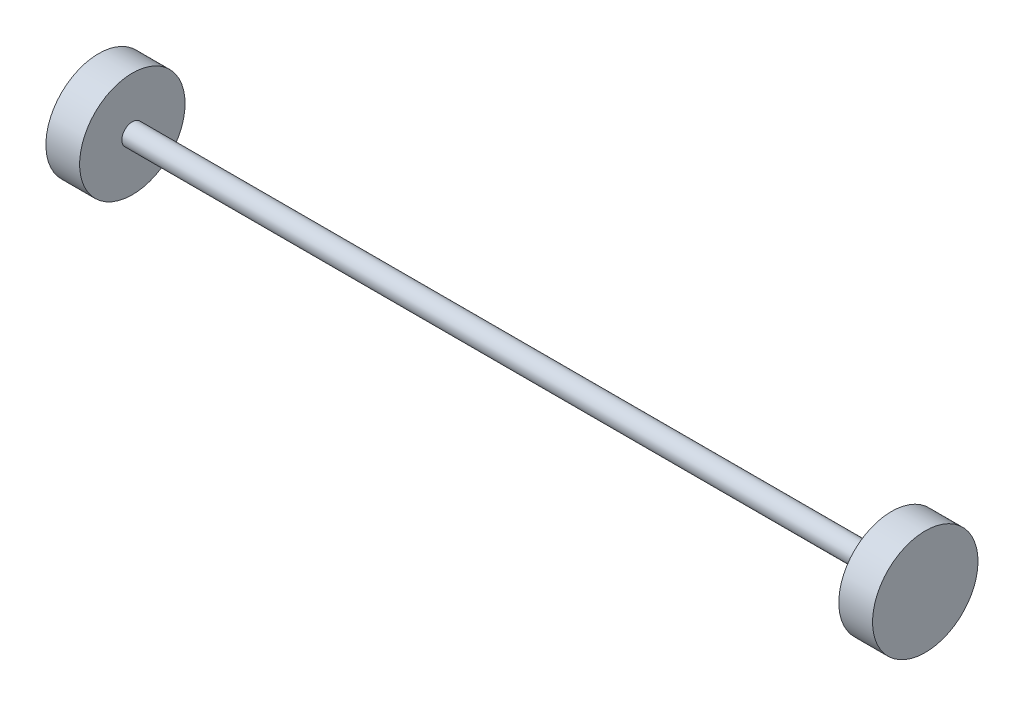
ISO-10303-21;
HEADER;
FILE_DESCRIPTION(('STEP AP214'),'2;1');
FILE_NAME('part.step','',(''),(''),'','','');
FILE_SCHEMA(('AUTOMOTIVE_DESIGN { 1 0 10303 214 1 1 1 1 }'));
ENDSEC;
DATA;
#1=APPLICATION_CONTEXT('core data for automotive mechanical design processes');
#2=APPLICATION_PROTOCOL_DEFINITION('international standard','automotive_design',2000,#1);
#3=PRODUCT_CONTEXT('',#1,'mechanical');
#4=PRODUCT('Part','Part','',(#3));
#5=PRODUCT_RELATED_PRODUCT_CATEGORY('part','',(#4));
#6=PRODUCT_DEFINITION_FORMATION('','',#4);
#7=PRODUCT_DEFINITION_CONTEXT('part definition',#1,'design');
#8=PRODUCT_DEFINITION('design','',#6,#7);
#9=PRODUCT_DEFINITION_SHAPE('','',#8);
#10=(LENGTH_UNIT() NAMED_UNIT(*) SI_UNIT(.MILLI.,.METRE.));
#11=(NAMED_UNIT(*) PLANE_ANGLE_UNIT() SI_UNIT($,.RADIAN.));
#12=(NAMED_UNIT(*) SI_UNIT($,.STERADIAN.) SOLID_ANGLE_UNIT());
#13=UNCERTAINTY_MEASURE_WITH_UNIT(LENGTH_MEASURE(1.E-05),#10,'distance_accuracy_value','');
#14=(GEOMETRIC_REPRESENTATION_CONTEXT(3) GLOBAL_UNCERTAINTY_ASSIGNED_CONTEXT((#13)) GLOBAL_UNIT_ASSIGNED_CONTEXT((#10,
#11,#12)) REPRESENTATION_CONTEXT('',''));
#15=CARTESIAN_POINT('',(0.,0.,0.));
#16=DIRECTION('',(0.,0.,1.));
#17=DIRECTION('',(1.,0.,0.));
#18=AXIS2_PLACEMENT_3D('',#15,#16,#17);
#19=CARTESIAN_POINT('',(80.,0.,0.));
#20=DIRECTION('',(-1.,0.,0.));
#21=DIRECTION('',(0.,0.,1.));
#22=AXIS2_PLACEMENT_3D('',#19,#20,#21);
#23=CYLINDRICAL_SURFACE('',#22,125.);
#24=CARTESIAN_POINT('',(80.,0.,0.));
#25=DIRECTION('',(1.,0.,0.));
#26=DIRECTION('',(0.,0.,-1.));
#27=AXIS2_PLACEMENT_3D('',#24,#25,#26);
#28=CIRCLE('',#27,125.);
#29=CARTESIAN_POINT('',(80.,0.,-125.));
#30=VERTEX_POINT('',#29);
#31=EDGE_CURVE('E45',#30,#30,#28,.T.);
#32=ORIENTED_EDGE('',*,*,#31,.F.);
#33=EDGE_LOOP('',(#32));
#34=FACE_BOUND('',#33,.T.);
#35=CARTESIAN_POINT('',(0.,0.,0.));
#36=DIRECTION('',(1.,0.,0.));
#37=DIRECTION('',(0.,0.,-1.));
#38=AXIS2_PLACEMENT_3D('',#35,#36,#37);
#39=CIRCLE('',#38,125.);
#40=CARTESIAN_POINT('',(0.,0.,-125.));
#41=VERTEX_POINT('',#40);
#42=EDGE_CURVE('E40',#41,#41,#39,.T.);
#43=ORIENTED_EDGE('',*,*,#42,.T.);
#44=EDGE_LOOP('',(#43));
#45=FACE_BOUND('',#44,.T.);
#46=ADVANCED_FACE('F37',(#34,#45),#23,.T.);
#47=CARTESIAN_POINT('',(80.,0.,0.));
#48=DIRECTION('',(1.,0.,0.));
#49=DIRECTION('',(0.,0.,-1.));
#50=AXIS2_PLACEMENT_3D('',#47,#48,#49);
#51=PLANE('',#50);
#52=CARTESIAN_POINT('',(80.,0.,0.));
#53=DIRECTION('',(1.,0.,0.));
#54=DIRECTION('',(0.,0.,-1.));
#55=AXIS2_PLACEMENT_3D('',#52,#53,#54);
#56=CIRCLE('',#55,25.);
#57=CARTESIAN_POINT('',(80.,0.,-25.));
#58=VERTEX_POINT('',#57);
#59=EDGE_CURVE('E10',#58,#58,#56,.T.);
#60=ORIENTED_EDGE('',*,*,#59,.F.);
#61=EDGE_LOOP('',(#60));
#62=FACE_BOUND('',#61,.T.);
#63=ORIENTED_EDGE('',*,*,#31,.T.);
#64=EDGE_LOOP('',(#63));
#65=FACE_BOUND('',#64,.T.);
#66=ADVANCED_FACE('F83',(#62,#65),#51,.T.);
#67=CARTESIAN_POINT('',(0.,0.,0.));
#68=DIRECTION('',(1.,0.,0.));
#69=DIRECTION('',(0.,0.,-1.));
#70=AXIS2_PLACEMENT_3D('',#67,#68,#69);
#71=PLANE('',#70);
#72=ORIENTED_EDGE('',*,*,#42,.F.);
#73=EDGE_LOOP('',(#72));
#74=FACE_BOUND('',#73,.T.);
#75=ADVANCED_FACE('F88',(#74),#71,.F.);
#76=CARTESIAN_POINT('',(1880.,0.,0.));
#77=DIRECTION('',(-1.,0.,0.));
#78=DIRECTION('',(0.,0.,1.));
#79=AXIS2_PLACEMENT_3D('',#76,#77,#78);
#80=CYLINDRICAL_SURFACE('',#79,25.);
#81=CARTESIAN_POINT('',(1880.,0.,0.));
#82=DIRECTION('',(1.,0.,0.));
#83=DIRECTION('',(0.,0.,-1.));
#84=AXIS2_PLACEMENT_3D('',#81,#82,#83);
#85=CIRCLE('',#84,25.);
#86=CARTESIAN_POINT('',(1880.,0.,-25.));
#87=VERTEX_POINT('',#86);
#88=EDGE_CURVE('E52',#87,#87,#85,.T.);
#89=ORIENTED_EDGE('',*,*,#88,.F.);
#90=EDGE_LOOP('',(#89));
#91=FACE_BOUND('',#90,.T.);
#92=ORIENTED_EDGE('',*,*,#59,.T.);
#93=EDGE_LOOP('',(#92));
#94=FACE_BOUND('',#93,.T.);
#95=ADVANCED_FACE('F70',(#91,#94),#80,.T.);
#96=CARTESIAN_POINT('',(1960.,0.,0.));
#97=DIRECTION('',(-1.,0.,0.));
#98=DIRECTION('',(0.,0.,1.));
#99=AXIS2_PLACEMENT_3D('',#96,#97,#98);
#100=CYLINDRICAL_SURFACE('',#99,125.);
#101=CARTESIAN_POINT('',(1960.,0.,0.));
#102=DIRECTION('',(1.,0.,0.));
#103=DIRECTION('',(0.,0.,-1.));
#104=AXIS2_PLACEMENT_3D('',#101,#102,#103);
#105=CIRCLE('',#104,125.);
#106=CARTESIAN_POINT('',(1960.,0.,-125.));
#107=VERTEX_POINT('',#106);
#108=EDGE_CURVE('E56',#107,#107,#105,.T.);
#109=ORIENTED_EDGE('',*,*,#108,.F.);
#110=EDGE_LOOP('',(#109));
#111=FACE_BOUND('',#110,.T.);
#112=CARTESIAN_POINT('',(1880.,0.,0.));
#113=DIRECTION('',(1.,0.,0.));
#114=DIRECTION('',(0.,0.,-1.));
#115=AXIS2_PLACEMENT_3D('',#112,#113,#114);
#116=CIRCLE('',#115,125.);
#117=CARTESIAN_POINT('',(1880.,0.,-125.));
#118=VERTEX_POINT('',#117);
#119=EDGE_CURVE('E57',#118,#118,#116,.T.);
#120=ORIENTED_EDGE('',*,*,#119,.T.);
#121=EDGE_LOOP('',(#120));
#122=FACE_BOUND('',#121,.T.);
#123=ADVANCED_FACE('F67',(#111,#122),#100,.T.);
#124=CARTESIAN_POINT('',(1960.,0.,0.));
#125=DIRECTION('',(1.,0.,0.));
#126=DIRECTION('',(0.,0.,-1.));
#127=AXIS2_PLACEMENT_3D('',#124,#125,#126);
#128=PLANE('',#127);
#129=ORIENTED_EDGE('',*,*,#108,.T.);
#130=EDGE_LOOP('',(#129));
#131=FACE_BOUND('',#130,.T.);
#132=ADVANCED_FACE('F65',(#131),#128,.T.);
#133=CARTESIAN_POINT('',(1880.,0.,0.));
#134=DIRECTION('',(1.,0.,0.));
#135=DIRECTION('',(0.,0.,-1.));
#136=AXIS2_PLACEMENT_3D('',#133,#134,#135);
#137=PLANE('',#136);
#138=ORIENTED_EDGE('',*,*,#88,.T.);
#139=EDGE_LOOP('',(#138));
#140=FACE_BOUND('',#139,.T.);
#141=ORIENTED_EDGE('',*,*,#119,.F.);
#142=EDGE_LOOP('',(#141));
#143=FACE_BOUND('',#142,.T.);
#144=ADVANCED_FACE('F74',(#140,#143),#137,.F.);
#145=CLOSED_SHELL('',(#46,#66,#75,#95,#123,#132,#144));
#146=MANIFOLD_SOLID_BREP('B2',#145);
#147=ADVANCED_BREP_SHAPE_REPRESENTATION('',(#18,#146),#14);
#148=SHAPE_DEFINITION_REPRESENTATION(#9,#147);
ENDSEC;
END-ISO-10303-21;
